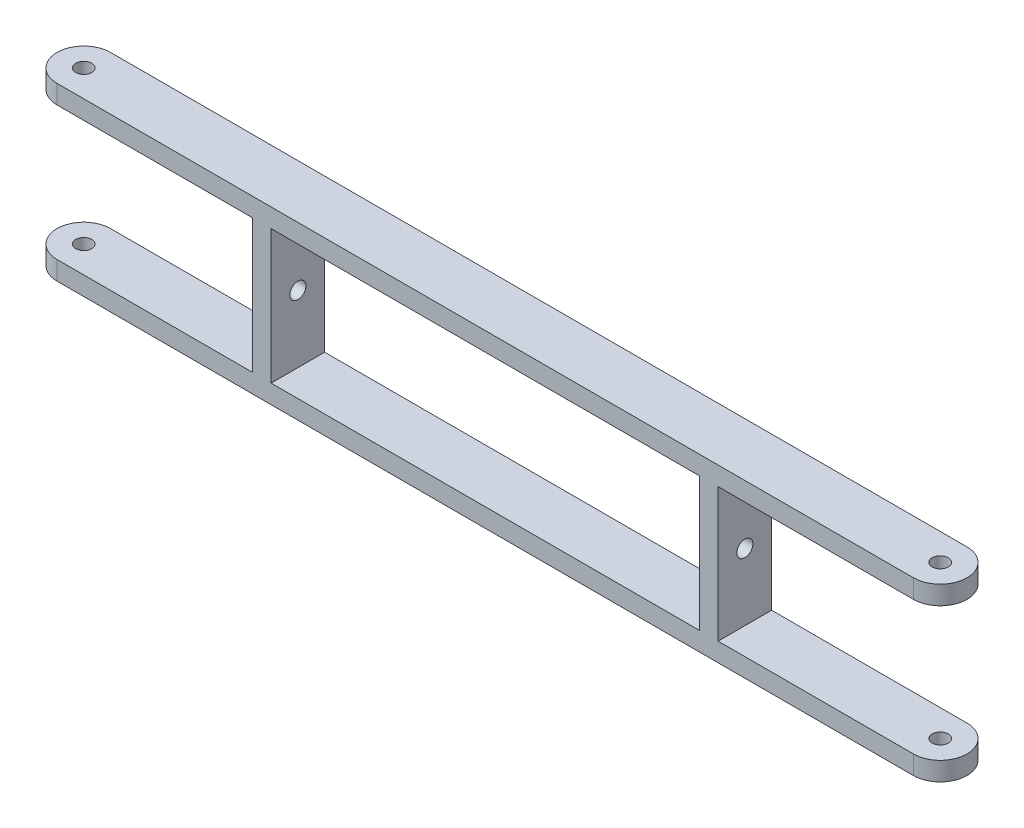
ISO-10303-21;
HEADER;
FILE_DESCRIPTION(('STEP AP214'),'2;1');
FILE_NAME('part.step','',(''),(''),'','','');
FILE_SCHEMA(('AUTOMOTIVE_DESIGN { 1 0 10303 214 1 1 1 1 }'));
ENDSEC;
DATA;
#1=APPLICATION_CONTEXT('core data for automotive mechanical design processes');
#2=APPLICATION_PROTOCOL_DEFINITION('international standard','automotive_design',2000,#1);
#3=PRODUCT_CONTEXT('',#1,'mechanical');
#4=PRODUCT('Part','Part','',(#3));
#5=PRODUCT_RELATED_PRODUCT_CATEGORY('part','',(#4));
#6=PRODUCT_DEFINITION_FORMATION('','',#4);
#7=PRODUCT_DEFINITION_CONTEXT('part definition',#1,'design');
#8=PRODUCT_DEFINITION('design','',#6,#7);
#9=PRODUCT_DEFINITION_SHAPE('','',#8);
#10=(LENGTH_UNIT() NAMED_UNIT(*) SI_UNIT(.MILLI.,.METRE.));
#11=(NAMED_UNIT(*) PLANE_ANGLE_UNIT() SI_UNIT($,.RADIAN.));
#12=(NAMED_UNIT(*) SI_UNIT($,.STERADIAN.) SOLID_ANGLE_UNIT());
#13=UNCERTAINTY_MEASURE_WITH_UNIT(LENGTH_MEASURE(1.E-05),#10,'distance_accuracy_value','');
#14=(GEOMETRIC_REPRESENTATION_CONTEXT(3) GLOBAL_UNCERTAINTY_ASSIGNED_CONTEXT((#13)) GLOBAL_UNIT_ASSIGNED_CONTEXT((#10,
#11,#12)) REPRESENTATION_CONTEXT('',''));
#15=CARTESIAN_POINT('',(0.,0.,0.));
#16=DIRECTION('',(0.,0.,1.));
#17=DIRECTION('',(1.,0.,0.));
#18=AXIS2_PLACEMENT_3D('',#15,#16,#17);
#19=CARTESIAN_POINT('',(-80.0000000000001,12.5,125.));
#20=DIRECTION('',(0.,1.,0.));
#21=DIRECTION('',(0.,0.,1.));
#22=AXIS2_PLACEMENT_3D('',#19,#20,#21);
#23=PLANE('',#22);
#24=CARTESIAN_POINT('',(-80.0000000000001,12.5,125.));
#25=DIRECTION('',(0.,1.,0.));
#26=DIRECTION('',(0.,0.,1.));
#27=AXIS2_PLACEMENT_3D('',#24,#25,#26);
#28=CIRCLE('',#27,1.5);
#29=CARTESIAN_POINT('',(-80.0000000000001,12.5,126.5));
#30=VERTEX_POINT('',#29);
#31=EDGE_CURVE('E261',#30,#30,#28,.T.);
#32=ORIENTED_EDGE('',*,*,#31,.T.);
#33=EDGE_LOOP('',(#32));
#34=FACE_BOUND('',#33,.T.);
#35=DIRECTION('',(-1.,0.,0.));
#36=VECTOR('',#35,1.);
#37=CARTESIAN_POINT('',(-80.0000000000001,12.5,120.));
#38=LINE('',#37,#36);
#39=CARTESIAN_POINT('',(-43.5,12.5,120.));
#40=VERTEX_POINT('',#39);
#41=CARTESIAN_POINT('',(-80.0000000000001,12.5,120.));
#42=VERTEX_POINT('',#41);
#43=EDGE_CURVE('E290',#40,#42,#38,.T.);
#44=ORIENTED_EDGE('',*,*,#43,.F.);
#45=DIRECTION('',(0.,0.,1.));
#46=VECTOR('',#45,1.);
#47=CARTESIAN_POINT('',(-43.5,12.5,120.));
#48=LINE('',#47,#46);
#49=CARTESIAN_POINT('',(-43.5,12.5,130.));
#50=VERTEX_POINT('',#49);
#51=EDGE_CURVE('E59',#40,#50,#48,.T.);
#52=ORIENTED_EDGE('',*,*,#51,.T.);
#53=DIRECTION('',(1.,0.,0.));
#54=VECTOR('',#53,1.);
#55=CARTESIAN_POINT('',(79.9999999999999,12.5,130.));
#56=LINE('',#55,#54);
#57=CARTESIAN_POINT('',(-80.0000000000001,12.5,130.));
#58=VERTEX_POINT('',#57);
#59=EDGE_CURVE('E284',#58,#50,#56,.T.);
#60=ORIENTED_EDGE('',*,*,#59,.F.);
#61=CARTESIAN_POINT('',(-80.0000000000001,12.5,125.));
#62=DIRECTION('',(0.,1.,0.));
#63=DIRECTION('',(0.,0.,1.));
#64=AXIS2_PLACEMENT_3D('',#61,#62,#63);
#65=CIRCLE('',#64,5.);
#66=EDGE_CURVE('E267',#42,#58,#65,.T.);
#67=ORIENTED_EDGE('',*,*,#66,.F.);
#68=EDGE_LOOP('',(#44,#52,#60,#67));
#69=FACE_BOUND('',#68,.T.);
#70=ADVANCED_FACE('F43',(#34,#69),#23,.F.);
#71=CARTESIAN_POINT('',(-80.0000000000001,-12.5,125.));
#72=DIRECTION('',(0.,-1.,0.));
#73=DIRECTION('',(0.,0.,1.));
#74=AXIS2_PLACEMENT_3D('',#71,#72,#73);
#75=PLANE('',#74);
#76=CARTESIAN_POINT('',(-80.0000000000001,-12.5,125.));
#77=DIRECTION('',(0.,1.,0.));
#78=DIRECTION('',(0.,0.,1.));
#79=AXIS2_PLACEMENT_3D('',#76,#77,#78);
#80=CIRCLE('',#79,1.5);
#81=CARTESIAN_POINT('',(-80.0000000000001,-12.5,126.5));
#82=VERTEX_POINT('',#81);
#83=EDGE_CURVE('E202',#82,#82,#80,.T.);
#84=ORIENTED_EDGE('',*,*,#83,.F.);
#85=EDGE_LOOP('',(#84));
#86=FACE_BOUND('',#85,.T.);
#87=DIRECTION('',(1.,0.,0.));
#88=VECTOR('',#87,1.);
#89=CARTESIAN_POINT('',(79.9999999999999,-12.5,130.));
#90=LINE('',#89,#88);
#91=CARTESIAN_POINT('',(-80.0000000000001,-12.5,130.));
#92=VERTEX_POINT('',#91);
#93=CARTESIAN_POINT('',(-43.5,-12.5,130.));
#94=VERTEX_POINT('',#93);
#95=EDGE_CURVE('E176',#92,#94,#90,.T.);
#96=ORIENTED_EDGE('',*,*,#95,.T.);
#97=DIRECTION('',(0.,0.,1.));
#98=VECTOR('',#97,1.);
#99=CARTESIAN_POINT('',(-43.5,-12.5,120.));
#100=LINE('',#99,#98);
#101=CARTESIAN_POINT('',(-43.5,-12.5,120.));
#102=VERTEX_POINT('',#101);
#103=EDGE_CURVE('E173',#102,#94,#100,.T.);
#104=ORIENTED_EDGE('',*,*,#103,.F.);
#105=DIRECTION('',(-1.,0.,0.));
#106=VECTOR('',#105,1.);
#107=CARTESIAN_POINT('',(-80.0000000000001,-12.5,120.));
#108=LINE('',#107,#106);
#109=CARTESIAN_POINT('',(-80.0000000000001,-12.5,120.));
#110=VERTEX_POINT('',#109);
#111=EDGE_CURVE('E157',#102,#110,#108,.T.);
#112=ORIENTED_EDGE('',*,*,#111,.T.);
#113=CARTESIAN_POINT('',(-80.0000000000001,-12.5,125.));
#114=DIRECTION('',(0.,1.,0.));
#115=DIRECTION('',(0.,0.,1.));
#116=AXIS2_PLACEMENT_3D('',#113,#114,#115);
#117=CIRCLE('',#116,5.);
#118=EDGE_CURVE('E208',#110,#92,#117,.T.);
#119=ORIENTED_EDGE('',*,*,#118,.T.);
#120=EDGE_LOOP('',(#96,#104,#112,#119));
#121=FACE_BOUND('',#120,.T.);
#122=ADVANCED_FACE('F174',(#86,#121),#75,.F.);
#123=CARTESIAN_POINT('',(-40.,12.5,130.));
#124=VERTEX_POINT('',#123);
#125=CARTESIAN_POINT('',(40.,12.5,130.));
#126=VERTEX_POINT('',#125);
#127=EDGE_CURVE('E288',#124,#126,#56,.T.);
#128=ORIENTED_EDGE('',*,*,#127,.F.);
#129=DIRECTION('',(0.,0.,-1.));
#130=VECTOR('',#129,1.);
#131=CARTESIAN_POINT('',(-40.,12.5,120.));
#132=LINE('',#131,#130);
#133=CARTESIAN_POINT('',(-40.,12.5,120.));
#134=VERTEX_POINT('',#133);
#135=EDGE_CURVE('E178',#124,#134,#132,.T.);
#136=ORIENTED_EDGE('',*,*,#135,.T.);
#137=CARTESIAN_POINT('',(40.,12.5,120.));
#138=VERTEX_POINT('',#137);
#139=EDGE_CURVE('E293',#138,#134,#38,.T.);
#140=ORIENTED_EDGE('',*,*,#139,.F.);
#141=DIRECTION('',(0.,0.,1.));
#142=VECTOR('',#141,1.);
#143=CARTESIAN_POINT('',(40.,12.5,120.));
#144=LINE('',#143,#142);
#145=EDGE_CURVE('E236',#138,#126,#144,.T.);
#146=ORIENTED_EDGE('',*,*,#145,.T.);
#147=EDGE_LOOP('',(#128,#136,#140,#146));
#148=FACE_BOUND('',#147,.T.);
#149=ADVANCED_FACE('F334',(#148),#23,.F.);
#150=CARTESIAN_POINT('',(-80.0000000000001,16.,125.));
#151=DIRECTION('',(0.,1.,0.));
#152=DIRECTION('',(0.,0.,1.));
#153=AXIS2_PLACEMENT_3D('',#150,#151,#152);
#154=PLANE('',#153);
#155=CARTESIAN_POINT('',(-80.0000000000001,16.,125.));
#156=DIRECTION('',(0.,1.,0.));
#157=DIRECTION('',(0.,0.,1.));
#158=AXIS2_PLACEMENT_3D('',#155,#156,#157);
#159=CIRCLE('',#158,1.5);
#160=CARTESIAN_POINT('',(-80.0000000000001,16.,126.5));
#161=VERTEX_POINT('',#160);
#162=EDGE_CURVE('E264',#161,#161,#159,.T.);
#163=ORIENTED_EDGE('',*,*,#162,.F.);
#164=EDGE_LOOP('',(#163));
#165=FACE_BOUND('',#164,.T.);
#166=CARTESIAN_POINT('',(-80.0000000000001,16.,125.));
#167=DIRECTION('',(0.,1.,0.));
#168=DIRECTION('',(0.,0.,1.));
#169=AXIS2_PLACEMENT_3D('',#166,#167,#168);
#170=CIRCLE('',#169,5.);
#171=CARTESIAN_POINT('',(-80.0000000000001,16.,120.));
#172=VERTEX_POINT('',#171);
#173=CARTESIAN_POINT('',(-80.0000000000001,16.,130.));
#174=VERTEX_POINT('',#173);
#175=EDGE_CURVE('E270',#172,#174,#170,.T.);
#176=ORIENTED_EDGE('',*,*,#175,.T.);
#177=DIRECTION('',(1.,0.,0.));
#178=VECTOR('',#177,1.);
#179=CARTESIAN_POINT('',(79.9999999999999,16.,130.));
#180=LINE('',#179,#178);
#181=CARTESIAN_POINT('',(79.9999999999999,16.,130.));
#182=VERTEX_POINT('',#181);
#183=EDGE_CURVE('E273',#174,#182,#180,.T.);
#184=ORIENTED_EDGE('',*,*,#183,.T.);
#185=CARTESIAN_POINT('',(79.9999999999999,16.,125.));
#186=DIRECTION('',(0.,1.,0.));
#187=DIRECTION('',(0.,0.,1.));
#188=AXIS2_PLACEMENT_3D('',#185,#186,#187);
#189=CIRCLE('',#188,5.);
#190=CARTESIAN_POINT('',(79.9999999999999,16.,120.));
#191=VERTEX_POINT('',#190);
#192=EDGE_CURVE('E276',#182,#191,#189,.T.);
#193=ORIENTED_EDGE('',*,*,#192,.T.);
#194=DIRECTION('',(-1.,0.,0.));
#195=VECTOR('',#194,1.);
#196=CARTESIAN_POINT('',(-80.0000000000001,16.,120.));
#197=LINE('',#196,#195);
#198=EDGE_CURVE('E278',#191,#172,#197,.T.);
#199=ORIENTED_EDGE('',*,*,#198,.T.);
#200=EDGE_LOOP('',(#176,#184,#193,#199));
#201=FACE_BOUND('',#200,.T.);
#202=CARTESIAN_POINT('',(79.9999999999999,16.,125.));
#203=DIRECTION('',(0.,1.,0.));
#204=DIRECTION('',(0.,0.,1.));
#205=AXIS2_PLACEMENT_3D('',#202,#203,#204);
#206=CIRCLE('',#205,1.5);
#207=CARTESIAN_POINT('',(79.9999999999999,16.,126.5));
#208=VERTEX_POINT('',#207);
#209=EDGE_CURVE('E258',#208,#208,#206,.T.);
#210=ORIENTED_EDGE('',*,*,#209,.F.);
#211=EDGE_LOOP('',(#210));
#212=FACE_BOUND('',#211,.T.);
#213=ADVANCED_FACE('F319',(#165,#201,#212),#154,.T.);
#214=CARTESIAN_POINT('',(43.5,12.5,130.));
#215=VERTEX_POINT('',#214);
#216=CARTESIAN_POINT('',(79.9999999999999,12.5,130.));
#217=VERTEX_POINT('',#216);
#218=EDGE_CURVE('E283',#215,#217,#56,.T.);
#219=ORIENTED_EDGE('',*,*,#218,.F.);
#220=DIRECTION('',(0.,0.,-1.));
#221=VECTOR('',#220,1.);
#222=CARTESIAN_POINT('',(43.5,12.5,120.));
#223=LINE('',#222,#221);
#224=CARTESIAN_POINT('',(43.5,12.5,120.));
#225=VERTEX_POINT('',#224);
#226=EDGE_CURVE('E237',#215,#225,#223,.T.);
#227=ORIENTED_EDGE('',*,*,#226,.T.);
#228=CARTESIAN_POINT('',(79.9999999999999,12.5,120.));
#229=VERTEX_POINT('',#228);
#230=EDGE_CURVE('E274',#229,#225,#38,.T.);
#231=ORIENTED_EDGE('',*,*,#230,.F.);
#232=CARTESIAN_POINT('',(79.9999999999999,12.5,125.));
#233=DIRECTION('',(0.,1.,0.));
#234=DIRECTION('',(0.,0.,1.));
#235=AXIS2_PLACEMENT_3D('',#232,#233,#234);
#236=CIRCLE('',#235,5.);
#237=EDGE_CURVE('E287',#217,#229,#236,.T.);
#238=ORIENTED_EDGE('',*,*,#237,.F.);
#239=EDGE_LOOP('',(#219,#227,#231,#238));
#240=FACE_BOUND('',#239,.T.);
#241=CARTESIAN_POINT('',(79.9999999999999,12.5,125.));
#242=DIRECTION('',(0.,1.,0.));
#243=DIRECTION('',(0.,0.,1.));
#244=AXIS2_PLACEMENT_3D('',#241,#242,#243);
#245=CIRCLE('',#244,1.5);
#246=CARTESIAN_POINT('',(79.9999999999999,12.5,126.5));
#247=VERTEX_POINT('',#246);
#248=EDGE_CURVE('E257',#247,#247,#245,.T.);
#249=ORIENTED_EDGE('',*,*,#248,.T.);
#250=EDGE_LOOP('',(#249));
#251=FACE_BOUND('',#250,.T.);
#252=ADVANCED_FACE('F310',(#240,#251),#23,.F.);
#253=CARTESIAN_POINT('',(-80.0000000000001,16.,125.));
#254=DIRECTION('',(0.,-1.,0.));
#255=DIRECTION('',(0.,0.,-1.));
#256=AXIS2_PLACEMENT_3D('',#253,#254,#255);
#257=CYLINDRICAL_SURFACE('',#256,5.);
#258=ORIENTED_EDGE('',*,*,#66,.T.);
#259=DIRECTION('',(0.,-1.,0.));
#260=VECTOR('',#259,1.);
#261=CARTESIAN_POINT('',(-80.0000000000001,16.,130.));
#262=LINE('',#261,#260);
#263=EDGE_CURVE('E11',#174,#58,#262,.T.);
#264=ORIENTED_EDGE('',*,*,#263,.F.);
#265=ORIENTED_EDGE('',*,*,#175,.F.);
#266=DIRECTION('',(0.,-1.,0.));
#267=VECTOR('',#266,1.);
#268=CARTESIAN_POINT('',(-80.0000000000001,16.,120.));
#269=LINE('',#268,#267);
#270=EDGE_CURVE('E280',#172,#42,#269,.T.);
#271=ORIENTED_EDGE('',*,*,#270,.T.);
#272=EDGE_LOOP('',(#258,#264,#265,#271));
#273=FACE_BOUND('',#272,.T.);
#274=ADVANCED_FACE('F45',(#273),#257,.T.);
#275=CARTESIAN_POINT('',(79.9999999999999,16.,130.));
#276=DIRECTION('',(0.,0.,-1.));
#277=DIRECTION('',(-1.,0.,0.));
#278=AXIS2_PLACEMENT_3D('',#275,#276,#277);
#279=PLANE('',#278);
#280=DIRECTION('',(0.,1.,0.));
#281=VECTOR('',#280,1.);
#282=CARTESIAN_POINT('',(-40.,-23.0948100502086,130.));
#283=LINE('',#282,#281);
#284=CARTESIAN_POINT('',(-40.,-12.5,130.));
#285=VERTEX_POINT('',#284);
#286=EDGE_CURVE('E192',#285,#124,#283,.T.);
#287=ORIENTED_EDGE('',*,*,#286,.T.);
#288=ORIENTED_EDGE('',*,*,#127,.T.);
#289=DIRECTION('',(0.,1.,0.));
#290=VECTOR('',#289,1.);
#291=CARTESIAN_POINT('',(40.,-23.0948100502086,130.));
#292=LINE('',#291,#290);
#293=CARTESIAN_POINT('',(40.,-12.5,130.));
#294=VERTEX_POINT('',#293);
#295=EDGE_CURVE('E246',#294,#126,#292,.T.);
#296=ORIENTED_EDGE('',*,*,#295,.F.);
#297=EDGE_CURVE('E225',#285,#294,#90,.T.);
#298=ORIENTED_EDGE('',*,*,#297,.F.);
#299=EDGE_LOOP('',(#287,#288,#296,#298));
#300=FACE_BOUND('',#299,.T.);
#301=ORIENTED_EDGE('',*,*,#59,.T.);
#302=DIRECTION('',(0.,1.,0.));
#303=VECTOR('',#302,1.);
#304=CARTESIAN_POINT('',(-43.5,-23.0948100502086,130.));
#305=LINE('',#304,#303);
#306=EDGE_CURVE('E179',#94,#50,#305,.T.);
#307=ORIENTED_EDGE('',*,*,#306,.F.);
#308=ORIENTED_EDGE('',*,*,#95,.F.);
#309=DIRECTION('',(0.,1.,0.));
#310=VECTOR('',#309,1.);
#311=CARTESIAN_POINT('',(-80.0000000000001,-16.,130.));
#312=LINE('',#311,#310);
#313=CARTESIAN_POINT('',(-80.0000000000001,-16.,130.));
#314=VERTEX_POINT('',#313);
#315=EDGE_CURVE('E234',#314,#92,#312,.T.);
#316=ORIENTED_EDGE('',*,*,#315,.F.);
#317=DIRECTION('',(1.,0.,0.));
#318=VECTOR('',#317,1.);
#319=CARTESIAN_POINT('',(79.9999999999999,-16.,130.));
#320=LINE('',#319,#318);
#321=CARTESIAN_POINT('',(79.9999999999999,-16.,130.));
#322=VERTEX_POINT('',#321);
#323=EDGE_CURVE('E214',#314,#322,#320,.T.);
#324=ORIENTED_EDGE('',*,*,#323,.T.);
#325=DIRECTION('',(0.,1.,0.));
#326=VECTOR('',#325,1.);
#327=CARTESIAN_POINT('',(79.9999999999999,-16.,130.));
#328=LINE('',#327,#326);
#329=CARTESIAN_POINT('',(79.9999999999999,-12.5,130.));
#330=VERTEX_POINT('',#329);
#331=EDGE_CURVE('E231',#322,#330,#328,.T.);
#332=ORIENTED_EDGE('',*,*,#331,.T.);
#333=CARTESIAN_POINT('',(43.5,-12.5,130.));
#334=VERTEX_POINT('',#333);
#335=EDGE_CURVE('E223',#334,#330,#90,.T.);
#336=ORIENTED_EDGE('',*,*,#335,.F.);
#337=DIRECTION('',(0.,1.,0.));
#338=VECTOR('',#337,1.);
#339=CARTESIAN_POINT('',(43.5,-23.0948100502086,130.));
#340=LINE('',#339,#338);
#341=EDGE_CURVE('E240',#334,#215,#340,.T.);
#342=ORIENTED_EDGE('',*,*,#341,.T.);
#343=ORIENTED_EDGE('',*,*,#218,.T.);
#344=DIRECTION('',(0.,-1.,0.));
#345=VECTOR('',#344,1.);
#346=CARTESIAN_POINT('',(79.9999999999999,16.,130.));
#347=LINE('',#346,#345);
#348=EDGE_CURVE('E52',#182,#217,#347,.T.);
#349=ORIENTED_EDGE('',*,*,#348,.F.);
#350=ORIENTED_EDGE('',*,*,#183,.F.);
#351=ORIENTED_EDGE('',*,*,#263,.T.);
#352=EDGE_LOOP('',(#301,#307,#308,#316,#324,#332,#336,#342,#343,#349,#350,#351));
#353=FACE_BOUND('',#352,.T.);
#354=ADVANCED_FACE('F322',(#300,#353),#279,.F.);
#355=CARTESIAN_POINT('',(79.9999999999999,16.,125.));
#356=DIRECTION('',(0.,-1.,0.));
#357=DIRECTION('',(0.,0.,-1.));
#358=AXIS2_PLACEMENT_3D('',#355,#356,#357);
#359=CYLINDRICAL_SURFACE('',#358,5.);
#360=ORIENTED_EDGE('',*,*,#237,.T.);
#361=DIRECTION('',(0.,-1.,0.));
#362=VECTOR('',#361,1.);
#363=CARTESIAN_POINT('',(79.9999999999999,16.,120.));
#364=LINE('',#363,#362);
#365=EDGE_CURVE('E296',#191,#229,#364,.T.);
#366=ORIENTED_EDGE('',*,*,#365,.F.);
#367=ORIENTED_EDGE('',*,*,#192,.F.);
#368=ORIENTED_EDGE('',*,*,#348,.T.);
#369=EDGE_LOOP('',(#360,#366,#367,#368));
#370=FACE_BOUND('',#369,.T.);
#371=ADVANCED_FACE('F304',(#370),#359,.T.);
#372=CARTESIAN_POINT('',(-80.0000000000001,16.,120.));
#373=DIRECTION('',(0.,0.,1.));
#374=DIRECTION('',(1.,0.,0.));
#375=AXIS2_PLACEMENT_3D('',#372,#373,#374);
#376=PLANE('',#375);
#377=DIRECTION('',(0.,1.,0.));
#378=VECTOR('',#377,1.);
#379=CARTESIAN_POINT('',(-43.5,-23.0948100502086,120.));
#380=LINE('',#379,#378);
#381=EDGE_CURVE('E161',#102,#40,#380,.T.);
#382=ORIENTED_EDGE('',*,*,#381,.T.);
#383=ORIENTED_EDGE('',*,*,#43,.T.);
#384=ORIENTED_EDGE('',*,*,#270,.F.);
#385=ORIENTED_EDGE('',*,*,#198,.F.);
#386=ORIENTED_EDGE('',*,*,#365,.T.);
#387=ORIENTED_EDGE('',*,*,#230,.T.);
#388=DIRECTION('',(0.,1.,0.));
#389=VECTOR('',#388,1.);
#390=CARTESIAN_POINT('',(43.5,-23.0948100502086,120.));
#391=LINE('',#390,#389);
#392=CARTESIAN_POINT('',(43.5,-12.5,120.));
#393=VERTEX_POINT('',#392);
#394=EDGE_CURVE('E251',#393,#225,#391,.T.);
#395=ORIENTED_EDGE('',*,*,#394,.F.);
#396=CARTESIAN_POINT('',(79.9999999999999,-12.5,120.));
#397=VERTEX_POINT('',#396);
#398=EDGE_CURVE('E171',#397,#393,#108,.T.);
#399=ORIENTED_EDGE('',*,*,#398,.F.);
#400=DIRECTION('',(0.,1.,0.));
#401=VECTOR('',#400,1.);
#402=CARTESIAN_POINT('',(79.9999999999999,-16.,120.));
#403=LINE('',#402,#401);
#404=CARTESIAN_POINT('',(79.9999999999999,-16.,120.));
#405=VERTEX_POINT('',#404);
#406=EDGE_CURVE('E229',#405,#397,#403,.T.);
#407=ORIENTED_EDGE('',*,*,#406,.F.);
#408=DIRECTION('',(-1.,0.,0.));
#409=VECTOR('',#408,1.);
#410=CARTESIAN_POINT('',(-80.0000000000001,-16.,120.));
#411=LINE('',#410,#409);
#412=CARTESIAN_POINT('',(-80.0000000000001,-16.,120.));
#413=VERTEX_POINT('',#412);
#414=EDGE_CURVE('E220',#405,#413,#411,.T.);
#415=ORIENTED_EDGE('',*,*,#414,.T.);
#416=DIRECTION('',(0.,1.,0.));
#417=VECTOR('',#416,1.);
#418=CARTESIAN_POINT('',(-80.0000000000001,-16.,120.));
#419=LINE('',#418,#417);
#420=EDGE_CURVE('E164',#413,#110,#419,.T.);
#421=ORIENTED_EDGE('',*,*,#420,.T.);
#422=ORIENTED_EDGE('',*,*,#111,.F.);
#423=EDGE_LOOP('',(#382,#383,#384,#385,#386,#387,#395,#399,#407,#415,#421,#422));
#424=FACE_BOUND('',#423,.T.);
#425=ORIENTED_EDGE('',*,*,#139,.T.);
#426=DIRECTION('',(0.,1.,0.));
#427=VECTOR('',#426,1.);
#428=CARTESIAN_POINT('',(-40.,-23.0948100502086,120.));
#429=LINE('',#428,#427);
#430=CARTESIAN_POINT('',(-40.,-12.5,120.));
#431=VERTEX_POINT('',#430);
#432=EDGE_CURVE('E182',#431,#134,#429,.T.);
#433=ORIENTED_EDGE('',*,*,#432,.F.);
#434=CARTESIAN_POINT('',(40.,-12.5,120.));
#435=VERTEX_POINT('',#434);
#436=EDGE_CURVE('E168',#435,#431,#108,.T.);
#437=ORIENTED_EDGE('',*,*,#436,.F.);
#438=DIRECTION('',(0.,1.,0.));
#439=VECTOR('',#438,1.);
#440=CARTESIAN_POINT('',(40.,-23.0948100502086,120.));
#441=LINE('',#440,#439);
#442=EDGE_CURVE('E247',#435,#138,#441,.T.);
#443=ORIENTED_EDGE('',*,*,#442,.T.);
#444=EDGE_LOOP('',(#425,#433,#437,#443));
#445=FACE_BOUND('',#444,.T.);
#446=ADVANCED_FACE('F159',(#424,#445),#376,.F.);
#447=CARTESIAN_POINT('',(-80.0000000000001,16.,125.));
#448=DIRECTION('',(0.,-1.,0.));
#449=DIRECTION('',(0.,0.,-1.));
#450=AXIS2_PLACEMENT_3D('',#447,#448,#449);
#451=CYLINDRICAL_SURFACE('',#450,1.5);
#452=ORIENTED_EDGE('',*,*,#162,.T.);
#453=EDGE_LOOP('',(#452));
#454=FACE_BOUND('',#453,.T.);
#455=ORIENTED_EDGE('',*,*,#31,.F.);
#456=EDGE_LOOP('',(#455));
#457=FACE_BOUND('',#456,.T.);
#458=ADVANCED_FACE('F393',(#454,#457),#451,.F.);
#459=CARTESIAN_POINT('',(79.9999999999999,16.,125.));
#460=DIRECTION('',(0.,-1.,0.));
#461=DIRECTION('',(0.,0.,-1.));
#462=AXIS2_PLACEMENT_3D('',#459,#460,#461);
#463=CYLINDRICAL_SURFACE('',#462,1.5);
#464=ORIENTED_EDGE('',*,*,#209,.T.);
#465=EDGE_LOOP('',(#464));
#466=FACE_BOUND('',#465,.T.);
#467=ORIENTED_EDGE('',*,*,#248,.F.);
#468=EDGE_LOOP('',(#467));
#469=FACE_BOUND('',#468,.T.);
#470=ADVANCED_FACE('F396',(#466,#469),#463,.F.);
#471=CARTESIAN_POINT('',(43.5,-23.0948100502086,120.));
#472=DIRECTION('',(1.,0.,0.));
#473=DIRECTION('',(0.,0.,-1.));
#474=AXIS2_PLACEMENT_3D('',#471,#472,#473);
#475=PLANE('',#474);
#476=CARTESIAN_POINT('',(43.5,0.,125.));
#477=DIRECTION('',(1.,0.,0.));
#478=DIRECTION('',(0.,0.,-1.));
#479=AXIS2_PLACEMENT_3D('',#476,#477,#478);
#480=CIRCLE('',#479,1.5);
#481=CARTESIAN_POINT('',(43.5,0.,123.5));
#482=VERTEX_POINT('',#481);
#483=EDGE_CURVE('E183',#482,#482,#480,.T.);
#484=ORIENTED_EDGE('',*,*,#483,.F.);
#485=EDGE_LOOP('',(#484));
#486=FACE_BOUND('',#485,.T.);
#487=ORIENTED_EDGE('',*,*,#341,.F.);
#488=DIRECTION('',(0.,0.,-1.));
#489=VECTOR('',#488,1.);
#490=CARTESIAN_POINT('',(43.5,-12.5,120.));
#491=LINE('',#490,#489);
#492=EDGE_CURVE('E248',#334,#393,#491,.T.);
#493=ORIENTED_EDGE('',*,*,#492,.T.);
#494=ORIENTED_EDGE('',*,*,#394,.T.);
#495=ORIENTED_EDGE('',*,*,#226,.F.);
#496=EDGE_LOOP('',(#487,#493,#494,#495));
#497=FACE_BOUND('',#496,.T.);
#498=ADVANCED_FACE('F400',(#486,#497),#475,.T.);
#499=CARTESIAN_POINT('',(40.,-23.0948100502086,120.));
#500=DIRECTION('',(-1.,0.,0.));
#501=DIRECTION('',(0.,0.,1.));
#502=AXIS2_PLACEMENT_3D('',#499,#500,#501);
#503=PLANE('',#502);
#504=CARTESIAN_POINT('',(40.,0.,125.));
#505=DIRECTION('',(-1.,0.,0.));
#506=DIRECTION('',(0.,0.,1.));
#507=AXIS2_PLACEMENT_3D('',#504,#505,#506);
#508=CIRCLE('',#507,1.5);
#509=CARTESIAN_POINT('',(40.,0.,126.5));
#510=VERTEX_POINT('',#509);
#511=EDGE_CURVE('E187',#510,#510,#508,.T.);
#512=ORIENTED_EDGE('',*,*,#511,.F.);
#513=EDGE_LOOP('',(#512));
#514=FACE_BOUND('',#513,.T.);
#515=ORIENTED_EDGE('',*,*,#442,.F.);
#516=DIRECTION('',(0.,0.,1.));
#517=VECTOR('',#516,1.);
#518=CARTESIAN_POINT('',(40.,-12.5,120.));
#519=LINE('',#518,#517);
#520=EDGE_CURVE('E243',#435,#294,#519,.T.);
#521=ORIENTED_EDGE('',*,*,#520,.T.);
#522=ORIENTED_EDGE('',*,*,#295,.T.);
#523=ORIENTED_EDGE('',*,*,#145,.F.);
#524=EDGE_LOOP('',(#515,#521,#522,#523));
#525=FACE_BOUND('',#524,.T.);
#526=ADVANCED_FACE('F403',(#514,#525),#503,.T.);
#527=ORIENTED_EDGE('',*,*,#436,.T.);
#528=DIRECTION('',(0.,0.,-1.));
#529=VECTOR('',#528,1.);
#530=CARTESIAN_POINT('',(-40.,-12.5,120.));
#531=LINE('',#530,#529);
#532=EDGE_CURVE('E67',#285,#431,#531,.T.);
#533=ORIENTED_EDGE('',*,*,#532,.F.);
#534=ORIENTED_EDGE('',*,*,#297,.T.);
#535=ORIENTED_EDGE('',*,*,#520,.F.);
#536=EDGE_LOOP('',(#527,#533,#534,#535));
#537=FACE_BOUND('',#536,.T.);
#538=ADVANCED_FACE('F368',(#537),#75,.F.);
#539=CARTESIAN_POINT('',(-80.0000000000001,-16.,125.));
#540=DIRECTION('',(0.,-1.,0.));
#541=DIRECTION('',(0.,0.,1.));
#542=AXIS2_PLACEMENT_3D('',#539,#540,#541);
#543=PLANE('',#542);
#544=CARTESIAN_POINT('',(-80.0000000000001,-16.,125.));
#545=DIRECTION('',(0.,1.,0.));
#546=DIRECTION('',(0.,0.,1.));
#547=AXIS2_PLACEMENT_3D('',#544,#545,#546);
#548=CIRCLE('',#547,1.5);
#549=CARTESIAN_POINT('',(-80.0000000000001,-16.,126.5));
#550=VERTEX_POINT('',#549);
#551=EDGE_CURVE('E205',#550,#550,#548,.T.);
#552=ORIENTED_EDGE('',*,*,#551,.T.);
#553=EDGE_LOOP('',(#552));
#554=FACE_BOUND('',#553,.T.);
#555=CARTESIAN_POINT('',(-80.0000000000001,-16.,125.));
#556=DIRECTION('',(0.,1.,0.));
#557=DIRECTION('',(0.,0.,1.));
#558=AXIS2_PLACEMENT_3D('',#555,#556,#557);
#559=CIRCLE('',#558,5.);
#560=EDGE_CURVE('E211',#413,#314,#559,.T.);
#561=ORIENTED_EDGE('',*,*,#560,.F.);
#562=ORIENTED_EDGE('',*,*,#414,.F.);
#563=CARTESIAN_POINT('',(79.9999999999999,-16.,125.));
#564=DIRECTION('',(0.,1.,0.));
#565=DIRECTION('',(0.,0.,1.));
#566=AXIS2_PLACEMENT_3D('',#563,#564,#565);
#567=CIRCLE('',#566,5.);
#568=EDGE_CURVE('E217',#322,#405,#567,.T.);
#569=ORIENTED_EDGE('',*,*,#568,.F.);
#570=ORIENTED_EDGE('',*,*,#323,.F.);
#571=EDGE_LOOP('',(#561,#562,#569,#570));
#572=FACE_BOUND('',#571,.T.);
#573=CARTESIAN_POINT('',(79.9999999999999,-16.,125.));
#574=DIRECTION('',(0.,1.,0.));
#575=DIRECTION('',(0.,0.,1.));
#576=AXIS2_PLACEMENT_3D('',#573,#574,#575);
#577=CIRCLE('',#576,1.5);
#578=CARTESIAN_POINT('',(79.9999999999999,-16.,126.5));
#579=VERTEX_POINT('',#578);
#580=EDGE_CURVE('E199',#579,#579,#577,.T.);
#581=ORIENTED_EDGE('',*,*,#580,.T.);
#582=EDGE_LOOP('',(#581));
#583=FACE_BOUND('',#582,.T.);
#584=ADVANCED_FACE('F354',(#554,#572,#583),#543,.T.);
#585=ORIENTED_EDGE('',*,*,#492,.F.);
#586=ORIENTED_EDGE('',*,*,#335,.T.);
#587=CARTESIAN_POINT('',(79.9999999999999,-12.5,125.));
#588=DIRECTION('',(0.,1.,0.));
#589=DIRECTION('',(0.,0.,1.));
#590=AXIS2_PLACEMENT_3D('',#587,#588,#589);
#591=CIRCLE('',#590,5.);
#592=EDGE_CURVE('E169',#330,#397,#591,.T.);
#593=ORIENTED_EDGE('',*,*,#592,.T.);
#594=ORIENTED_EDGE('',*,*,#398,.T.);
#595=EDGE_LOOP('',(#585,#586,#593,#594));
#596=FACE_BOUND('',#595,.T.);
#597=CARTESIAN_POINT('',(79.9999999999999,-12.5,125.));
#598=DIRECTION('',(0.,1.,0.));
#599=DIRECTION('',(0.,0.,1.));
#600=AXIS2_PLACEMENT_3D('',#597,#598,#599);
#601=CIRCLE('',#600,1.5);
#602=CARTESIAN_POINT('',(79.9999999999999,-12.5,126.5));
#603=VERTEX_POINT('',#602);
#604=EDGE_CURVE('E196',#603,#603,#601,.T.);
#605=ORIENTED_EDGE('',*,*,#604,.F.);
#606=EDGE_LOOP('',(#605));
#607=FACE_BOUND('',#606,.T.);
#608=ADVANCED_FACE('F343',(#596,#607),#75,.F.);
#609=CARTESIAN_POINT('',(-80.0000000000001,-16.,125.));
#610=DIRECTION('',(0.,1.,0.));
#611=DIRECTION('',(0.,0.,-1.));
#612=AXIS2_PLACEMENT_3D('',#609,#610,#611);
#613=CYLINDRICAL_SURFACE('',#612,5.);
#614=ORIENTED_EDGE('',*,*,#118,.F.);
#615=ORIENTED_EDGE('',*,*,#420,.F.);
#616=ORIENTED_EDGE('',*,*,#560,.T.);
#617=ORIENTED_EDGE('',*,*,#315,.T.);
#618=EDGE_LOOP('',(#614,#615,#616,#617));
#619=FACE_BOUND('',#618,.T.);
#620=ADVANCED_FACE('F357',(#619),#613,.T.);
#621=CARTESIAN_POINT('',(79.9999999999999,-16.,125.));
#622=DIRECTION('',(0.,1.,0.));
#623=DIRECTION('',(0.,0.,-1.));
#624=AXIS2_PLACEMENT_3D('',#621,#622,#623);
#625=CYLINDRICAL_SURFACE('',#624,5.);
#626=ORIENTED_EDGE('',*,*,#592,.F.);
#627=ORIENTED_EDGE('',*,*,#331,.F.);
#628=ORIENTED_EDGE('',*,*,#568,.T.);
#629=ORIENTED_EDGE('',*,*,#406,.T.);
#630=EDGE_LOOP('',(#626,#627,#628,#629));
#631=FACE_BOUND('',#630,.T.);
#632=ADVANCED_FACE('F350',(#631),#625,.T.);
#633=CARTESIAN_POINT('',(-80.0000000000001,-16.,125.));
#634=DIRECTION('',(0.,1.,0.));
#635=DIRECTION('',(0.,0.,-1.));
#636=AXIS2_PLACEMENT_3D('',#633,#634,#635);
#637=CYLINDRICAL_SURFACE('',#636,1.5);
#638=ORIENTED_EDGE('',*,*,#551,.F.);
#639=EDGE_LOOP('',(#638));
#640=FACE_BOUND('',#639,.T.);
#641=ORIENTED_EDGE('',*,*,#83,.T.);
#642=EDGE_LOOP('',(#641));
#643=FACE_BOUND('',#642,.T.);
#644=ADVANCED_FACE('F365',(#640,#643),#637,.F.);
#645=CARTESIAN_POINT('',(79.9999999999999,-16.,125.));
#646=DIRECTION('',(0.,1.,0.));
#647=DIRECTION('',(0.,0.,-1.));
#648=AXIS2_PLACEMENT_3D('',#645,#646,#647);
#649=CYLINDRICAL_SURFACE('',#648,1.5);
#650=ORIENTED_EDGE('',*,*,#580,.F.);
#651=EDGE_LOOP('',(#650));
#652=FACE_BOUND('',#651,.T.);
#653=ORIENTED_EDGE('',*,*,#604,.T.);
#654=EDGE_LOOP('',(#653));
#655=FACE_BOUND('',#654,.T.);
#656=ADVANCED_FACE('F434',(#652,#655),#649,.F.);
#657=CARTESIAN_POINT('',(-43.5,-23.0948100502086,120.));
#658=DIRECTION('',(-1.,0.,0.));
#659=DIRECTION('',(0.,0.,1.));
#660=AXIS2_PLACEMENT_3D('',#657,#658,#659);
#661=PLANE('',#660);
#662=CARTESIAN_POINT('',(-43.5,0.,125.));
#663=DIRECTION('',(-1.,0.,0.));
#664=DIRECTION('',(0.,0.,1.));
#665=AXIS2_PLACEMENT_3D('',#662,#663,#664);
#666=CIRCLE('',#665,1.5);
#667=CARTESIAN_POINT('',(-43.5,0.,126.5));
#668=VERTEX_POINT('',#667);
#669=EDGE_CURVE('E415',#668,#668,#666,.T.);
#670=ORIENTED_EDGE('',*,*,#669,.F.);
#671=EDGE_LOOP('',(#670));
#672=FACE_BOUND('',#671,.T.);
#673=ORIENTED_EDGE('',*,*,#381,.F.);
#674=ORIENTED_EDGE('',*,*,#103,.T.);
#675=ORIENTED_EDGE('',*,*,#306,.T.);
#676=ORIENTED_EDGE('',*,*,#51,.F.);
#677=EDGE_LOOP('',(#673,#674,#675,#676));
#678=FACE_BOUND('',#677,.T.);
#679=ADVANCED_FACE('F181',(#672,#678),#661,.T.);
#680=CARTESIAN_POINT('',(-40.,-23.0948100502086,120.));
#681=DIRECTION('',(1.,0.,0.));
#682=DIRECTION('',(0.,0.,-1.));
#683=AXIS2_PLACEMENT_3D('',#680,#681,#682);
#684=PLANE('',#683);
#685=CARTESIAN_POINT('',(-40.,0.,125.));
#686=DIRECTION('',(1.,0.,0.));
#687=DIRECTION('',(0.,0.,-1.));
#688=AXIS2_PLACEMENT_3D('',#685,#686,#687);
#689=CIRCLE('',#688,1.5);
#690=CARTESIAN_POINT('',(-40.,0.,123.5));
#691=VERTEX_POINT('',#690);
#692=EDGE_CURVE('E47',#691,#691,#689,.T.);
#693=ORIENTED_EDGE('',*,*,#692,.F.);
#694=EDGE_LOOP('',(#693));
#695=FACE_BOUND('',#694,.T.);
#696=ORIENTED_EDGE('',*,*,#286,.F.);
#697=ORIENTED_EDGE('',*,*,#532,.T.);
#698=ORIENTED_EDGE('',*,*,#432,.T.);
#699=ORIENTED_EDGE('',*,*,#135,.F.);
#700=EDGE_LOOP('',(#696,#697,#698,#699));
#701=FACE_BOUND('',#700,.T.);
#702=ADVANCED_FACE('F338',(#695,#701),#684,.T.);
#703=CARTESIAN_POINT('',(-100.,0.,125.));
#704=DIRECTION('',(1.,0.,0.));
#705=DIRECTION('',(0.,0.,-1.));
#706=AXIS2_PLACEMENT_3D('',#703,#704,#705);
#707=CYLINDRICAL_SURFACE('',#706,1.5);
#708=ORIENTED_EDGE('',*,*,#669,.T.);
#709=EDGE_LOOP('',(#708));
#710=FACE_BOUND('',#709,.T.);
#711=ORIENTED_EDGE('',*,*,#692,.T.);
#712=EDGE_LOOP('',(#711));
#713=FACE_BOUND('',#712,.T.);
#714=ADVANCED_FACE('F423',(#710,#713),#707,.F.);
#715=ORIENTED_EDGE('',*,*,#483,.T.);
#716=EDGE_LOOP('',(#715));
#717=FACE_BOUND('',#716,.T.);
#718=ORIENTED_EDGE('',*,*,#511,.T.);
#719=EDGE_LOOP('',(#718));
#720=FACE_BOUND('',#719,.T.);
#721=ADVANCED_FACE('F432',(#717,#720),#707,.F.);
#722=CLOSED_SHELL('',(#70,#122,#149,#213,#252,#274,#354,#371,#446,#458,#470,#498,#526,#538,#584,
#608,#620,#632,#644,#656,#679,#702,#714,#721));
#723=MANIFOLD_SOLID_BREP('B2',#722);
#724=ADVANCED_BREP_SHAPE_REPRESENTATION('',(#18,#723),#14);
#725=SHAPE_DEFINITION_REPRESENTATION(#9,#724);
ENDSEC;
END-ISO-10303-21;
